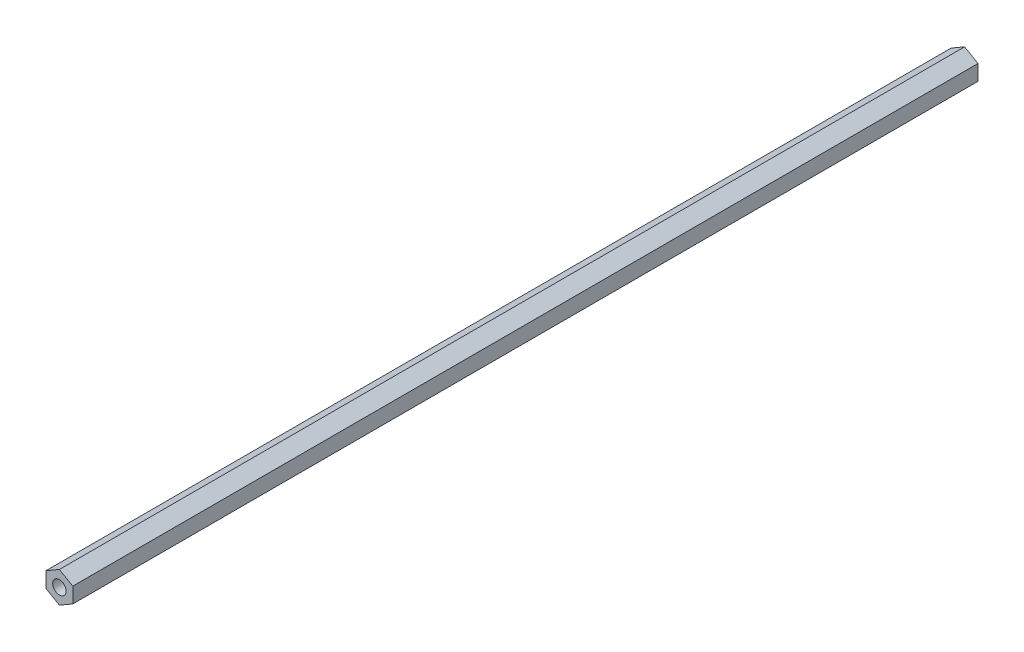
ISO-10303-21;
HEADER;
FILE_DESCRIPTION(('STEP AP214'),'2;1');
FILE_NAME('part.step','',(''),(''),'','','');
FILE_SCHEMA(('AUTOMOTIVE_DESIGN { 1 0 10303 214 1 1 1 1 }'));
ENDSEC;
DATA;
#1=APPLICATION_CONTEXT('core data for automotive mechanical design processes');
#2=APPLICATION_PROTOCOL_DEFINITION('international standard','automotive_design',2000,#1);
#3=PRODUCT_CONTEXT('',#1,'mechanical');
#4=PRODUCT('Part','Part','',(#3));
#5=PRODUCT_RELATED_PRODUCT_CATEGORY('part','',(#4));
#6=PRODUCT_DEFINITION_FORMATION('','',#4);
#7=PRODUCT_DEFINITION_CONTEXT('part definition',#1,'design');
#8=PRODUCT_DEFINITION('design','',#6,#7);
#9=PRODUCT_DEFINITION_SHAPE('','',#8);
#10=(LENGTH_UNIT() NAMED_UNIT(*) SI_UNIT(.MILLI.,.METRE.));
#11=(NAMED_UNIT(*) PLANE_ANGLE_UNIT() SI_UNIT($,.RADIAN.));
#12=(NAMED_UNIT(*) SI_UNIT($,.STERADIAN.) SOLID_ANGLE_UNIT());
#13=UNCERTAINTY_MEASURE_WITH_UNIT(LENGTH_MEASURE(1.E-05),#10,'distance_accuracy_value','');
#14=(GEOMETRIC_REPRESENTATION_CONTEXT(3) GLOBAL_UNCERTAINTY_ASSIGNED_CONTEXT((#13)) GLOBAL_UNIT_ASSIGNED_CONTEXT((#10,
#11,#12)) REPRESENTATION_CONTEXT('',''));
#15=CARTESIAN_POINT('',(0.,0.,0.));
#16=DIRECTION('',(0.,0.,1.));
#17=DIRECTION('',(1.,0.,0.));
#18=AXIS2_PLACEMENT_3D('',#15,#16,#17);
#19=CARTESIAN_POINT('',(-6.35,3.66617420935411,214.629999492));
#20=DIRECTION('',(1.,0.,0.));
#21=DIRECTION('',(0.,0.,-1.));
#22=AXIS2_PLACEMENT_3D('',#19,#20,#21);
#23=PLANE('',#22);
#24=DIRECTION('',(0.,0.,-1.));
#25=VECTOR('',#24,1.);
#26=CARTESIAN_POINT('',(-6.35,3.66617420935411,214.629999492));
#27=LINE('',#26,#25);
#28=CARTESIAN_POINT('',(-6.35,3.66617420935411,214.629999492));
#29=VERTEX_POINT('',#28);
#30=CARTESIAN_POINT('',(-6.35,3.66617420935411,-214.629999492));
#31=VERTEX_POINT('',#30);
#32=EDGE_CURVE('E141',#29,#31,#27,.T.);
#33=ORIENTED_EDGE('',*,*,#32,.T.);
#34=DIRECTION('',(0.,-1.,0.));
#35=VECTOR('',#34,1.);
#36=CARTESIAN_POINT('',(-6.35,3.66617420935411,-214.629999492));
#37=LINE('',#36,#35);
#38=CARTESIAN_POINT('',(-6.35,-3.66617420935413,-214.629999492));
#39=VERTEX_POINT('',#38);
#40=EDGE_CURVE('E113',#31,#39,#37,.T.);
#41=ORIENTED_EDGE('',*,*,#40,.T.);
#42=DIRECTION('',(0.,0.,-1.));
#43=VECTOR('',#42,1.);
#44=CARTESIAN_POINT('',(-6.35,-3.66617420935413,214.629999492));
#45=LINE('',#44,#43);
#46=CARTESIAN_POINT('',(-6.35,-3.66617420935413,214.629999492));
#47=VERTEX_POINT('',#46);
#48=EDGE_CURVE('E11',#47,#39,#45,.T.);
#49=ORIENTED_EDGE('',*,*,#48,.F.);
#50=DIRECTION('',(0.,-1.,0.));
#51=VECTOR('',#50,1.);
#52=CARTESIAN_POINT('',(-6.35,3.66617420935411,214.629999492));
#53=LINE('',#52,#51);
#54=EDGE_CURVE('E131',#29,#47,#53,.T.);
#55=ORIENTED_EDGE('',*,*,#54,.F.);
#56=EDGE_LOOP('',(#33,#41,#49,#55));
#57=FACE_BOUND('',#56,.T.);
#58=ADVANCED_FACE('F37',(#57),#23,.F.);
#59=CARTESIAN_POINT('',(-6.35,-3.66617420935413,214.629999492));
#60=DIRECTION('',(0.5,0.866025403784439,0.));
#61=DIRECTION('',(-0.866025403784439,0.5,0.));
#62=AXIS2_PLACEMENT_3D('',#59,#60,#61);
#63=PLANE('',#62);
#64=ORIENTED_EDGE('',*,*,#48,.T.);
#65=DIRECTION('',(0.866025403784439,-0.5,0.));
#66=VECTOR('',#65,1.);
#67=CARTESIAN_POINT('',(-6.35,-3.66617420935413,-214.629999492));
#68=LINE('',#67,#66);
#69=CARTESIAN_POINT('',(0.,-7.33234841870826,-214.629999492));
#70=VERTEX_POINT('',#69);
#71=EDGE_CURVE('E116',#39,#70,#68,.T.);
#72=ORIENTED_EDGE('',*,*,#71,.T.);
#73=DIRECTION('',(0.,0.,-1.));
#74=VECTOR('',#73,1.);
#75=CARTESIAN_POINT('',(0.,-7.33234841870826,214.629999492));
#76=LINE('',#75,#74);
#77=CARTESIAN_POINT('',(0.,-7.33234841870826,214.629999492));
#78=VERTEX_POINT('',#77);
#79=EDGE_CURVE('E44',#78,#70,#76,.T.);
#80=ORIENTED_EDGE('',*,*,#79,.F.);
#81=DIRECTION('',(0.866025403784439,-0.5,0.));
#82=VECTOR('',#81,1.);
#83=CARTESIAN_POINT('',(-6.35,-3.66617420935413,214.629999492));
#84=LINE('',#83,#82);
#85=EDGE_CURVE('E133',#47,#78,#84,.T.);
#86=ORIENTED_EDGE('',*,*,#85,.F.);
#87=EDGE_LOOP('',(#64,#72,#80,#86));
#88=FACE_BOUND('',#87,.T.);
#89=ADVANCED_FACE('F161',(#88),#63,.F.);
#90=CARTESIAN_POINT('',(0.,-7.33234841870826,214.629999492));
#91=DIRECTION('',(-0.5,0.866025403784439,0.));
#92=DIRECTION('',(-0.866025403784439,-0.5,0.));
#93=AXIS2_PLACEMENT_3D('',#90,#91,#92);
#94=PLANE('',#93);
#95=ORIENTED_EDGE('',*,*,#79,.T.);
#96=DIRECTION('',(0.866025403784439,0.5,0.));
#97=VECTOR('',#96,1.);
#98=CARTESIAN_POINT('',(0.,-7.33234841870826,-214.629999492));
#99=LINE('',#98,#97);
#100=CARTESIAN_POINT('',(6.35,-3.66617420935414,-214.629999492));
#101=VERTEX_POINT('',#100);
#102=EDGE_CURVE('E119',#70,#101,#99,.T.);
#103=ORIENTED_EDGE('',*,*,#102,.T.);
#104=DIRECTION('',(0.,0.,-1.));
#105=VECTOR('',#104,1.);
#106=CARTESIAN_POINT('',(6.35,-3.66617420935414,214.629999492));
#107=LINE('',#106,#105);
#108=CARTESIAN_POINT('',(6.35,-3.66617420935414,214.629999492));
#109=VERTEX_POINT('',#108);
#110=EDGE_CURVE('E147',#109,#101,#107,.T.);
#111=ORIENTED_EDGE('',*,*,#110,.F.);
#112=DIRECTION('',(0.866025403784439,0.5,0.));
#113=VECTOR('',#112,1.);
#114=CARTESIAN_POINT('',(0.,-7.33234841870826,214.629999492));
#115=LINE('',#114,#113);
#116=EDGE_CURVE('E135',#78,#109,#115,.T.);
#117=ORIENTED_EDGE('',*,*,#116,.F.);
#118=EDGE_LOOP('',(#95,#103,#111,#117));
#119=FACE_BOUND('',#118,.T.);
#120=ADVANCED_FACE('F152',(#119),#94,.F.);
#121=CARTESIAN_POINT('',(6.35,-3.66617420935414,214.629999492));
#122=DIRECTION('',(-1.,0.,0.));
#123=DIRECTION('',(0.,-1.,0.));
#124=AXIS2_PLACEMENT_3D('',#121,#122,#123);
#125=PLANE('',#124);
#126=ORIENTED_EDGE('',*,*,#110,.T.);
#127=DIRECTION('',(0.,1.,0.));
#128=VECTOR('',#127,1.);
#129=CARTESIAN_POINT('',(6.35,-3.66617420935414,-214.629999492));
#130=LINE('',#129,#128);
#131=CARTESIAN_POINT('',(6.35,3.66617420935412,-214.629999492));
#132=VERTEX_POINT('',#131);
#133=EDGE_CURVE('E122',#101,#132,#130,.T.);
#134=ORIENTED_EDGE('',*,*,#133,.T.);
#135=DIRECTION('',(0.,0.,-1.));
#136=VECTOR('',#135,1.);
#137=CARTESIAN_POINT('',(6.35,3.66617420935412,214.629999492));
#138=LINE('',#137,#136);
#139=CARTESIAN_POINT('',(6.35,3.66617420935412,214.629999492));
#140=VERTEX_POINT('',#139);
#141=EDGE_CURVE('E145',#140,#132,#138,.T.);
#142=ORIENTED_EDGE('',*,*,#141,.F.);
#143=DIRECTION('',(0.,1.,0.));
#144=VECTOR('',#143,1.);
#145=CARTESIAN_POINT('',(6.35,-3.66617420935414,214.629999492));
#146=LINE('',#145,#144);
#147=EDGE_CURVE('E137',#109,#140,#146,.T.);
#148=ORIENTED_EDGE('',*,*,#147,.F.);
#149=EDGE_LOOP('',(#126,#134,#142,#148));
#150=FACE_BOUND('',#149,.T.);
#151=ADVANCED_FACE('F172',(#150),#125,.F.);
#152=CARTESIAN_POINT('',(6.35,3.66617420935412,214.629999492));
#153=DIRECTION('',(-0.5,-0.866025403784438,0.));
#154=DIRECTION('',(0.866025403784439,-0.5,0.));
#155=AXIS2_PLACEMENT_3D('',#152,#153,#154);
#156=PLANE('',#155);
#157=ORIENTED_EDGE('',*,*,#141,.T.);
#158=DIRECTION('',(-0.866025403784439,0.5,0.));
#159=VECTOR('',#158,1.);
#160=CARTESIAN_POINT('',(6.35,3.66617420935412,-214.629999492));
#161=LINE('',#160,#159);
#162=CARTESIAN_POINT('',(0.,7.33234841870824,-214.629999492));
#163=VERTEX_POINT('',#162);
#164=EDGE_CURVE('E125',#132,#163,#161,.T.);
#165=ORIENTED_EDGE('',*,*,#164,.T.);
#166=DIRECTION('',(0.,0.,-1.));
#167=VECTOR('',#166,1.);
#168=CARTESIAN_POINT('',(0.,7.33234841870824,214.629999492));
#169=LINE('',#168,#167);
#170=CARTESIAN_POINT('',(0.,7.33234841870824,214.629999492));
#171=VERTEX_POINT('',#170);
#172=EDGE_CURVE('E143',#171,#163,#169,.T.);
#173=ORIENTED_EDGE('',*,*,#172,.F.);
#174=DIRECTION('',(-0.866025403784439,0.5,0.));
#175=VECTOR('',#174,1.);
#176=CARTESIAN_POINT('',(6.35,3.66617420935412,214.629999492));
#177=LINE('',#176,#175);
#178=EDGE_CURVE('E56',#140,#171,#177,.T.);
#179=ORIENTED_EDGE('',*,*,#178,.F.);
#180=EDGE_LOOP('',(#157,#165,#173,#179));
#181=FACE_BOUND('',#180,.T.);
#182=ADVANCED_FACE('F169',(#181),#156,.F.);
#183=CARTESIAN_POINT('',(0.,7.33234841870824,214.629999492));
#184=DIRECTION('',(0.5,-0.866025403784439,0.));
#185=DIRECTION('',(0.866025403784439,0.5,0.));
#186=AXIS2_PLACEMENT_3D('',#183,#184,#185);
#187=PLANE('',#186);
#188=ORIENTED_EDGE('',*,*,#172,.T.);
#189=DIRECTION('',(-0.866025403784439,-0.5,0.));
#190=VECTOR('',#189,1.);
#191=CARTESIAN_POINT('',(0.,7.33234841870824,-214.629999492));
#192=LINE('',#191,#190);
#193=EDGE_CURVE('E128',#163,#31,#192,.T.);
#194=ORIENTED_EDGE('',*,*,#193,.T.);
#195=ORIENTED_EDGE('',*,*,#32,.F.);
#196=DIRECTION('',(-0.866025403784439,-0.5,0.));
#197=VECTOR('',#196,1.);
#198=CARTESIAN_POINT('',(0.,7.33234841870824,214.629999492));
#199=LINE('',#198,#197);
#200=EDGE_CURVE('E51',#171,#29,#199,.T.);
#201=ORIENTED_EDGE('',*,*,#200,.F.);
#202=EDGE_LOOP('',(#188,#194,#195,#201));
#203=FACE_BOUND('',#202,.T.);
#204=ADVANCED_FACE('F167',(#203),#187,.F.);
#205=CARTESIAN_POINT('',(0.,0.,214.629999492));
#206=DIRECTION('',(0.,0.,1.));
#207=DIRECTION('',(1.,0.,0.));
#208=AXIS2_PLACEMENT_3D('',#205,#206,#207);
#209=PLANE('',#208);
#210=CARTESIAN_POINT('',(0.,0.,214.629999492));
#211=DIRECTION('',(0.,0.,1.));
#212=DIRECTION('',(1.,0.,0.));
#213=AXIS2_PLACEMENT_3D('',#210,#211,#212);
#214=CIRCLE('',#213,3.17499999999999);
#215=CARTESIAN_POINT('',(3.17499999999999,0.,214.629999492));
#216=VERTEX_POINT('',#215);
#217=EDGE_CURVE('E102',#216,#216,#214,.T.);
#218=ORIENTED_EDGE('',*,*,#217,.F.);
#219=EDGE_LOOP('',(#218));
#220=FACE_BOUND('',#219,.T.);
#221=ORIENTED_EDGE('',*,*,#54,.T.);
#222=ORIENTED_EDGE('',*,*,#85,.T.);
#223=ORIENTED_EDGE('',*,*,#116,.T.);
#224=ORIENTED_EDGE('',*,*,#147,.T.);
#225=ORIENTED_EDGE('',*,*,#178,.T.);
#226=ORIENTED_EDGE('',*,*,#200,.T.);
#227=EDGE_LOOP('',(#221,#222,#223,#224,#225,#226));
#228=FACE_BOUND('',#227,.T.);
#229=ADVANCED_FACE('F174',(#220,#228),#209,.T.);
#230=CARTESIAN_POINT('',(0.,0.,-214.629999492));
#231=DIRECTION('',(0.,0.,1.));
#232=DIRECTION('',(1.,0.,0.));
#233=AXIS2_PLACEMENT_3D('',#230,#231,#232);
#234=PLANE('',#233);
#235=CARTESIAN_POINT('',(0.,0.,-214.629999492));
#236=DIRECTION('',(0.,0.,-1.));
#237=DIRECTION('',(-1.,0.,0.));
#238=AXIS2_PLACEMENT_3D('',#235,#236,#237);
#239=CIRCLE('',#238,3.17499999999999);
#240=CARTESIAN_POINT('',(-3.17499999999999,0.,-214.629999492));
#241=VERTEX_POINT('',#240);
#242=EDGE_CURVE('E103',#241,#241,#239,.T.);
#243=ORIENTED_EDGE('',*,*,#242,.F.);
#244=EDGE_LOOP('',(#243));
#245=FACE_BOUND('',#244,.T.);
#246=ORIENTED_EDGE('',*,*,#40,.F.);
#247=ORIENTED_EDGE('',*,*,#193,.F.);
#248=ORIENTED_EDGE('',*,*,#164,.F.);
#249=ORIENTED_EDGE('',*,*,#133,.F.);
#250=ORIENTED_EDGE('',*,*,#102,.F.);
#251=ORIENTED_EDGE('',*,*,#71,.F.);
#252=EDGE_LOOP('',(#246,#247,#248,#249,#250,#251));
#253=FACE_BOUND('',#252,.T.);
#254=ADVANCED_FACE('F159',(#245,#253),#234,.F.);
#255=CARTESIAN_POINT('',(0.,0.,189.229999492));
#256=DIRECTION('',(0.,0.,1.));
#257=DIRECTION('',(1.,0.,0.));
#258=AXIS2_PLACEMENT_3D('',#255,#256,#257);
#259=CONICAL_SURFACE('',#258,3.17499999999995,1.02974425867665);
#260=CARTESIAN_POINT('',(0.,0.,187.322267026588));
#261=VERTEX_POINT('',#260);
#262=VERTEX_LOOP('',#261);
#263=FACE_BOUND('',#262,.T.);
#264=CARTESIAN_POINT('',(0.,0.,189.229999492));
#265=DIRECTION('',(0.,0.,1.));
#266=DIRECTION('',(1.,0.,0.));
#267=AXIS2_PLACEMENT_3D('',#264,#265,#266);
#268=CIRCLE('',#267,3.17499999999995);
#269=CARTESIAN_POINT('',(3.17499999999995,0.,189.229999492));
#270=VERTEX_POINT('',#269);
#271=EDGE_CURVE('E106',#270,#270,#268,.T.);
#272=ORIENTED_EDGE('',*,*,#271,.T.);
#273=EDGE_LOOP('',(#272));
#274=FACE_BOUND('',#273,.T.);
#275=ADVANCED_FACE('F182',(#263,#274),#259,.F.);
#276=CARTESIAN_POINT('',(0.,0.,214.629999492));
#277=DIRECTION('',(0.,0.,1.));
#278=DIRECTION('',(1.,0.,0.));
#279=AXIS2_PLACEMENT_3D('',#276,#277,#278);
#280=CYLINDRICAL_SURFACE('',#279,3.17499999999997);
#281=ORIENTED_EDGE('',*,*,#271,.F.);
#282=EDGE_LOOP('',(#281));
#283=FACE_BOUND('',#282,.T.);
#284=ORIENTED_EDGE('',*,*,#217,.T.);
#285=EDGE_LOOP('',(#284));
#286=FACE_BOUND('',#285,.T.);
#287=ADVANCED_FACE('F96',(#283,#286),#280,.F.);
#288=CARTESIAN_POINT('',(0.,0.,-189.229999492));
#289=DIRECTION('',(0.,0.,-1.));
#290=DIRECTION('',(-1.,0.,0.));
#291=AXIS2_PLACEMENT_3D('',#288,#289,#290);
#292=CONICAL_SURFACE('',#291,3.17499999999995,1.02974425867665);
#293=CARTESIAN_POINT('',(0.,0.,-187.322267026588));
#294=VERTEX_POINT('',#293);
#295=VERTEX_LOOP('',#294);
#296=FACE_BOUND('',#295,.T.);
#297=CARTESIAN_POINT('',(0.,0.,-189.229999492));
#298=DIRECTION('',(0.,0.,-1.));
#299=DIRECTION('',(-1.,0.,0.));
#300=AXIS2_PLACEMENT_3D('',#297,#298,#299);
#301=CIRCLE('',#300,3.17499999999995);
#302=CARTESIAN_POINT('',(-3.17499999999995,0.,-189.229999492));
#303=VERTEX_POINT('',#302);
#304=EDGE_CURVE('E100',#303,#303,#301,.T.);
#305=ORIENTED_EDGE('',*,*,#304,.T.);
#306=EDGE_LOOP('',(#305));
#307=FACE_BOUND('',#306,.T.);
#308=ADVANCED_FACE('F92',(#296,#307),#292,.F.);
#309=CARTESIAN_POINT('',(0.,0.,-214.629999492));
#310=DIRECTION('',(0.,0.,-1.));
#311=DIRECTION('',(-1.,0.,0.));
#312=AXIS2_PLACEMENT_3D('',#309,#310,#311);
#313=CYLINDRICAL_SURFACE('',#312,3.17499999999997);
#314=ORIENTED_EDGE('',*,*,#304,.F.);
#315=EDGE_LOOP('',(#314));
#316=FACE_BOUND('',#315,.T.);
#317=ORIENTED_EDGE('',*,*,#242,.T.);
#318=EDGE_LOOP('',(#317));
#319=FACE_BOUND('',#318,.T.);
#320=ADVANCED_FACE('F95',(#316,#319),#313,.F.);
#321=CLOSED_SHELL('',(#58,#89,#120,#151,#182,#204,#229,#254,#275,#287,#308,#320));
#322=MANIFOLD_SOLID_BREP('B2',#321);
#323=ADVANCED_BREP_SHAPE_REPRESENTATION('',(#18,#322),#14);
#324=SHAPE_DEFINITION_REPRESENTATION(#9,#323);
ENDSEC;
END-ISO-10303-21;
